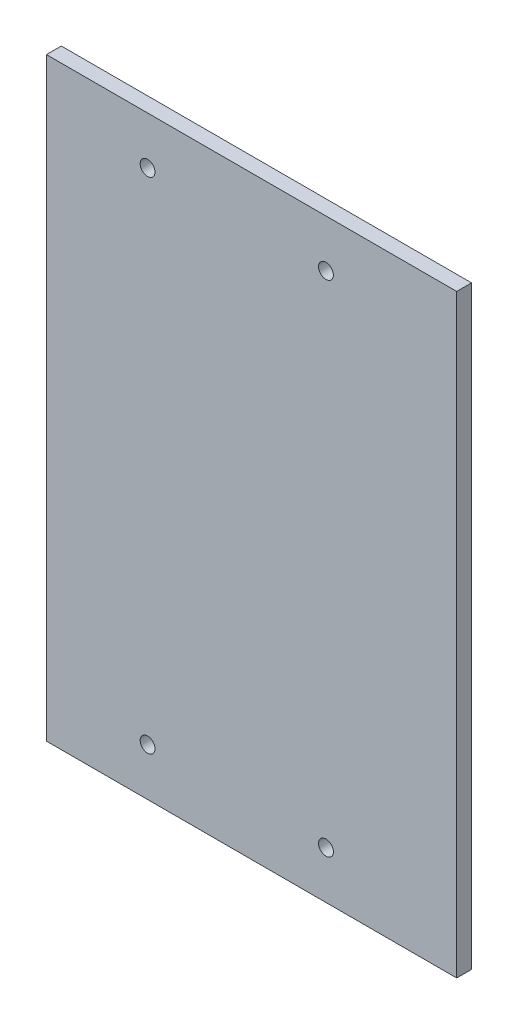
ISO-10303-21;
HEADER;
FILE_DESCRIPTION(('STEP AP214'),'2;1');
FILE_NAME('part.step','',(''),(''),'','','');
FILE_SCHEMA(('AUTOMOTIVE_DESIGN { 1 0 10303 214 1 1 1 1 }'));
ENDSEC;
DATA;
#1=APPLICATION_CONTEXT('core data for automotive mechanical design processes');
#2=APPLICATION_PROTOCOL_DEFINITION('international standard','automotive_design',2000,#1);
#3=PRODUCT_CONTEXT('',#1,'mechanical');
#4=PRODUCT('Part','Part','',(#3));
#5=PRODUCT_RELATED_PRODUCT_CATEGORY('part','',(#4));
#6=PRODUCT_DEFINITION_FORMATION('','',#4);
#7=PRODUCT_DEFINITION_CONTEXT('part definition',#1,'design');
#8=PRODUCT_DEFINITION('design','',#6,#7);
#9=PRODUCT_DEFINITION_SHAPE('','',#8);
#10=(LENGTH_UNIT() NAMED_UNIT(*) SI_UNIT(.MILLI.,.METRE.));
#11=(NAMED_UNIT(*) PLANE_ANGLE_UNIT() SI_UNIT($,.RADIAN.));
#12=(NAMED_UNIT(*) SI_UNIT($,.STERADIAN.) SOLID_ANGLE_UNIT());
#13=UNCERTAINTY_MEASURE_WITH_UNIT(LENGTH_MEASURE(1.E-05),#10,'distance_accuracy_value','');
#14=(GEOMETRIC_REPRESENTATION_CONTEXT(3) GLOBAL_UNCERTAINTY_ASSIGNED_CONTEXT((#13)) GLOBAL_UNIT_ASSIGNED_CONTEXT((#10,
#11,#12)) REPRESENTATION_CONTEXT('',''));
#15=CARTESIAN_POINT('',(0.,0.,0.));
#16=DIRECTION('',(0.,0.,1.));
#17=DIRECTION('',(1.,0.,0.));
#18=AXIS2_PLACEMENT_3D('',#15,#16,#17);
#19=CARTESIAN_POINT('',(-55.,100.,5.));
#20=DIRECTION('',(0.,-1.,0.));
#21=DIRECTION('',(0.,0.,-1.));
#22=AXIS2_PLACEMENT_3D('',#19,#20,#21);
#23=PLANE('',#22);
#24=DIRECTION('',(-1.,0.,0.));
#25=VECTOR('',#24,1.);
#26=CARTESIAN_POINT('',(-55.,100.,0.));
#27=LINE('',#26,#25);
#28=CARTESIAN_POINT('',(83.,100.,0.));
#29=VERTEX_POINT('',#28);
#30=CARTESIAN_POINT('',(-55.,100.,0.));
#31=VERTEX_POINT('',#30);
#32=EDGE_CURVE('E62',#29,#31,#27,.T.);
#33=ORIENTED_EDGE('',*,*,#32,.T.);
#34=DIRECTION('',(0.,0.,-1.));
#35=VECTOR('',#34,1.);
#36=CARTESIAN_POINT('',(-55.,100.,5.));
#37=LINE('',#36,#35);
#38=CARTESIAN_POINT('',(-55.,100.,5.));
#39=VERTEX_POINT('',#38);
#40=EDGE_CURVE('E11',#39,#31,#37,.T.);
#41=ORIENTED_EDGE('',*,*,#40,.F.);
#42=DIRECTION('',(-1.,0.,0.));
#43=VECTOR('',#42,1.);
#44=CARTESIAN_POINT('',(-55.,100.,5.));
#45=LINE('',#44,#43);
#46=CARTESIAN_POINT('',(83.,100.,5.));
#47=VERTEX_POINT('',#46);
#48=EDGE_CURVE('E87',#47,#39,#45,.T.);
#49=ORIENTED_EDGE('',*,*,#48,.F.);
#50=DIRECTION('',(0.,0.,1.));
#51=VECTOR('',#50,1.);
#52=CARTESIAN_POINT('',(83.,100.,0.));
#53=LINE('',#52,#51);
#54=EDGE_CURVE('E95',#29,#47,#53,.T.);
#55=ORIENTED_EDGE('',*,*,#54,.F.);
#56=EDGE_LOOP('',(#33,#41,#49,#55));
#57=FACE_BOUND('',#56,.T.);
#58=ADVANCED_FACE('F35',(#57),#23,.F.);
#59=CARTESIAN_POINT('',(-55.,100.,5.));
#60=DIRECTION('',(1.,0.,0.));
#61=DIRECTION('',(0.,1.,0.));
#62=AXIS2_PLACEMENT_3D('',#59,#60,#61);
#63=PLANE('',#62);
#64=DIRECTION('',(0.,-1.,0.));
#65=VECTOR('',#64,1.);
#66=CARTESIAN_POINT('',(-55.,100.,0.));
#67=LINE('',#66,#65);
#68=CARTESIAN_POINT('',(-55.,-100.,0.));
#69=VERTEX_POINT('',#68);
#70=EDGE_CURVE('E88',#31,#69,#67,.T.);
#71=ORIENTED_EDGE('',*,*,#70,.T.);
#72=DIRECTION('',(0.,0.,-1.));
#73=VECTOR('',#72,1.);
#74=CARTESIAN_POINT('',(-55.,-100.,5.));
#75=LINE('',#74,#73);
#76=CARTESIAN_POINT('',(-55.,-100.,5.));
#77=VERTEX_POINT('',#76);
#78=EDGE_CURVE('E43',#77,#69,#75,.T.);
#79=ORIENTED_EDGE('',*,*,#78,.F.);
#80=DIRECTION('',(0.,-1.,0.));
#81=VECTOR('',#80,1.);
#82=CARTESIAN_POINT('',(-55.,100.,5.));
#83=LINE('',#82,#81);
#84=EDGE_CURVE('E51',#39,#77,#83,.T.);
#85=ORIENTED_EDGE('',*,*,#84,.F.);
#86=ORIENTED_EDGE('',*,*,#40,.T.);
#87=EDGE_LOOP('',(#71,#79,#85,#86));
#88=FACE_BOUND('',#87,.T.);
#89=ADVANCED_FACE('F132',(#88),#63,.F.);
#90=CARTESIAN_POINT('',(-55.,-100.,5.));
#91=DIRECTION('',(0.,1.,0.));
#92=DIRECTION('',(0.,0.,1.));
#93=AXIS2_PLACEMENT_3D('',#90,#91,#92);
#94=PLANE('',#93);
#95=DIRECTION('',(1.,0.,0.));
#96=VECTOR('',#95,1.);
#97=CARTESIAN_POINT('',(-55.,-100.,0.));
#98=LINE('',#97,#96);
#99=CARTESIAN_POINT('',(83.,-100.,0.));
#100=VERTEX_POINT('',#99);
#101=EDGE_CURVE('E80',#69,#100,#98,.T.);
#102=ORIENTED_EDGE('',*,*,#101,.T.);
#103=DIRECTION('',(0.,0.,-1.));
#104=VECTOR('',#103,1.);
#105=CARTESIAN_POINT('',(83.,-100.,5.));
#106=LINE('',#105,#104);
#107=CARTESIAN_POINT('',(83.,-100.,5.));
#108=VERTEX_POINT('',#107);
#109=EDGE_CURVE('E84',#108,#100,#106,.T.);
#110=ORIENTED_EDGE('',*,*,#109,.F.);
#111=DIRECTION('',(1.,0.,0.));
#112=VECTOR('',#111,1.);
#113=CARTESIAN_POINT('',(-55.,-100.,5.));
#114=LINE('',#113,#112);
#115=EDGE_CURVE('E67',#77,#108,#114,.T.);
#116=ORIENTED_EDGE('',*,*,#115,.F.);
#117=ORIENTED_EDGE('',*,*,#78,.T.);
#118=EDGE_LOOP('',(#102,#110,#116,#117));
#119=FACE_BOUND('',#118,.T.);
#120=ADVANCED_FACE('F82',(#119),#94,.F.);
#121=CARTESIAN_POINT('',(0.,0.,5.));
#122=DIRECTION('',(0.,0.,1.));
#123=DIRECTION('',(1.,0.,0.));
#124=AXIS2_PLACEMENT_3D('',#121,#122,#123);
#125=PLANE('',#124);
#126=CARTESIAN_POINT('',(39.0192378864669,-83.9999999999995,5.));
#127=DIRECTION('',(0.,0.,-1.));
#128=DIRECTION('',(-1.,0.,0.));
#129=AXIS2_PLACEMENT_3D('',#126,#127,#128);
#130=CIRCLE('',#129,2.5);
#131=CARTESIAN_POINT('',(36.5192378864669,-83.9999999999995,5.));
#132=VERTEX_POINT('',#131);
#133=EDGE_CURVE('E110',#132,#132,#130,.T.);
#134=ORIENTED_EDGE('',*,*,#133,.T.);
#135=EDGE_LOOP('',(#134));
#136=FACE_BOUND('',#135,.T.);
#137=CARTESIAN_POINT('',(-20.980762113533,84.,5.));
#138=DIRECTION('',(0.,0.,-1.));
#139=DIRECTION('',(-1.,0.,0.));
#140=AXIS2_PLACEMENT_3D('',#137,#138,#139);
#141=CIRCLE('',#140,2.49999999999999);
#142=CARTESIAN_POINT('',(-23.480762113533,84.,5.));
#143=VERTEX_POINT('',#142);
#144=EDGE_CURVE('E117',#143,#143,#141,.T.);
#145=ORIENTED_EDGE('',*,*,#144,.T.);
#146=EDGE_LOOP('',(#145));
#147=FACE_BOUND('',#146,.T.);
#148=CARTESIAN_POINT('',(39.0192378864669,84.,5.));
#149=DIRECTION('',(0.,0.,-1.));
#150=DIRECTION('',(-1.,0.,0.));
#151=AXIS2_PLACEMENT_3D('',#148,#149,#150);
#152=CIRCLE('',#151,2.5);
#153=CARTESIAN_POINT('',(36.5192378864669,84.,5.));
#154=VERTEX_POINT('',#153);
#155=EDGE_CURVE('E104',#154,#154,#152,.T.);
#156=ORIENTED_EDGE('',*,*,#155,.T.);
#157=EDGE_LOOP('',(#156));
#158=FACE_BOUND('',#157,.T.);
#159=CARTESIAN_POINT('',(-20.980762113533,-83.9999999999995,5.));
#160=DIRECTION('',(0.,0.,-1.));
#161=DIRECTION('',(-1.,0.,0.));
#162=AXIS2_PLACEMENT_3D('',#159,#160,#161);
#163=CIRCLE('',#162,2.49999999999999);
#164=CARTESIAN_POINT('',(-23.480762113533,-83.9999999999995,5.));
#165=VERTEX_POINT('',#164);
#166=EDGE_CURVE('E122',#165,#165,#163,.T.);
#167=ORIENTED_EDGE('',*,*,#166,.T.);
#168=EDGE_LOOP('',(#167));
#169=FACE_BOUND('',#168,.T.);
#170=ORIENTED_EDGE('',*,*,#115,.T.);
#171=DIRECTION('',(0.,-1.,0.));
#172=VECTOR('',#171,1.);
#173=CARTESIAN_POINT('',(83.,100.,5.));
#174=LINE('',#173,#172);
#175=EDGE_CURVE('E98',#47,#108,#174,.T.);
#176=ORIENTED_EDGE('',*,*,#175,.F.);
#177=ORIENTED_EDGE('',*,*,#48,.T.);
#178=ORIENTED_EDGE('',*,*,#84,.T.);
#179=EDGE_LOOP('',(#170,#176,#177,#178));
#180=FACE_BOUND('',#179,.T.);
#181=ADVANCED_FACE('F133',(#136,#147,#158,#169,#180),#125,.T.);
#182=CARTESIAN_POINT('',(0.,0.,0.));
#183=DIRECTION('',(0.,0.,1.));
#184=DIRECTION('',(1.,0.,0.));
#185=AXIS2_PLACEMENT_3D('',#182,#183,#184);
#186=PLANE('',#185);
#187=CARTESIAN_POINT('',(39.0192378864669,-83.9999999999995,0.));
#188=DIRECTION('',(0.,0.,-1.));
#189=DIRECTION('',(-1.,0.,0.));
#190=AXIS2_PLACEMENT_3D('',#187,#188,#189);
#191=CIRCLE('',#190,2.5);
#192=CARTESIAN_POINT('',(36.5192378864669,-83.9999999999995,0.));
#193=VERTEX_POINT('',#192);
#194=EDGE_CURVE('E114',#193,#193,#191,.T.);
#195=ORIENTED_EDGE('',*,*,#194,.F.);
#196=EDGE_LOOP('',(#195));
#197=FACE_BOUND('',#196,.T.);
#198=CARTESIAN_POINT('',(-20.980762113533,84.,0.));
#199=DIRECTION('',(0.,0.,-1.));
#200=DIRECTION('',(-1.,0.,0.));
#201=AXIS2_PLACEMENT_3D('',#198,#199,#200);
#202=CIRCLE('',#201,2.49999999999999);
#203=CARTESIAN_POINT('',(-23.480762113533,84.,0.));
#204=VERTEX_POINT('',#203);
#205=EDGE_CURVE('E107',#204,#204,#202,.T.);
#206=ORIENTED_EDGE('',*,*,#205,.F.);
#207=EDGE_LOOP('',(#206));
#208=FACE_BOUND('',#207,.T.);
#209=CARTESIAN_POINT('',(39.0192378864669,84.,0.));
#210=DIRECTION('',(0.,0.,-1.));
#211=DIRECTION('',(-1.,0.,0.));
#212=AXIS2_PLACEMENT_3D('',#209,#210,#211);
#213=CIRCLE('',#212,2.5);
#214=CARTESIAN_POINT('',(36.5192378864669,84.,0.));
#215=VERTEX_POINT('',#214);
#216=EDGE_CURVE('E103',#215,#215,#213,.T.);
#217=ORIENTED_EDGE('',*,*,#216,.F.);
#218=EDGE_LOOP('',(#217));
#219=FACE_BOUND('',#218,.T.);
#220=CARTESIAN_POINT('',(-20.980762113533,-83.9999999999995,0.));
#221=DIRECTION('',(0.,0.,-1.));
#222=DIRECTION('',(-1.,0.,0.));
#223=AXIS2_PLACEMENT_3D('',#220,#221,#222);
#224=CIRCLE('',#223,2.49999999999999);
#225=CARTESIAN_POINT('',(-23.480762113533,-83.9999999999995,0.));
#226=VERTEX_POINT('',#225);
#227=EDGE_CURVE('E113',#226,#226,#224,.T.);
#228=ORIENTED_EDGE('',*,*,#227,.F.);
#229=EDGE_LOOP('',(#228));
#230=FACE_BOUND('',#229,.T.);
#231=ORIENTED_EDGE('',*,*,#32,.F.);
#232=DIRECTION('',(0.,1.,0.));
#233=VECTOR('',#232,1.);
#234=CARTESIAN_POINT('',(83.,-100.,0.));
#235=LINE('',#234,#233);
#236=EDGE_CURVE('E91',#100,#29,#235,.T.);
#237=ORIENTED_EDGE('',*,*,#236,.F.);
#238=ORIENTED_EDGE('',*,*,#101,.F.);
#239=ORIENTED_EDGE('',*,*,#70,.F.);
#240=EDGE_LOOP('',(#231,#237,#238,#239));
#241=FACE_BOUND('',#240,.T.);
#242=ADVANCED_FACE('F92',(#197,#208,#219,#230,#241),#186,.F.);
#243=CARTESIAN_POINT('',(-20.980762113533,-83.9999999999995,5.));
#244=DIRECTION('',(0.,0.,-1.));
#245=DIRECTION('',(-1.,0.,0.));
#246=AXIS2_PLACEMENT_3D('',#243,#244,#245);
#247=CYLINDRICAL_SURFACE('',#246,2.49999999999999);
#248=ORIENTED_EDGE('',*,*,#166,.F.);
#249=EDGE_LOOP('',(#248));
#250=FACE_BOUND('',#249,.T.);
#251=ORIENTED_EDGE('',*,*,#227,.T.);
#252=EDGE_LOOP('',(#251));
#253=FACE_BOUND('',#252,.T.);
#254=ADVANCED_FACE('F141',(#250,#253),#247,.F.);
#255=CARTESIAN_POINT('',(39.0192378864669,84.,5.));
#256=DIRECTION('',(0.,0.,-1.));
#257=DIRECTION('',(-1.,0.,0.));
#258=AXIS2_PLACEMENT_3D('',#255,#256,#257);
#259=CYLINDRICAL_SURFACE('',#258,2.5);
#260=ORIENTED_EDGE('',*,*,#155,.F.);
#261=EDGE_LOOP('',(#260));
#262=FACE_BOUND('',#261,.T.);
#263=ORIENTED_EDGE('',*,*,#216,.T.);
#264=EDGE_LOOP('',(#263));
#265=FACE_BOUND('',#264,.T.);
#266=ADVANCED_FACE('F160',(#262,#265),#259,.F.);
#267=CARTESIAN_POINT('',(-20.980762113533,84.,5.));
#268=DIRECTION('',(0.,0.,-1.));
#269=DIRECTION('',(-1.,0.,0.));
#270=AXIS2_PLACEMENT_3D('',#267,#268,#269);
#271=CYLINDRICAL_SURFACE('',#270,2.49999999999999);
#272=ORIENTED_EDGE('',*,*,#144,.F.);
#273=EDGE_LOOP('',(#272));
#274=FACE_BOUND('',#273,.T.);
#275=ORIENTED_EDGE('',*,*,#205,.T.);
#276=EDGE_LOOP('',(#275));
#277=FACE_BOUND('',#276,.T.);
#278=ADVANCED_FACE('F167',(#274,#277),#271,.F.);
#279=CARTESIAN_POINT('',(39.0192378864669,-83.9999999999995,5.));
#280=DIRECTION('',(0.,0.,-1.));
#281=DIRECTION('',(-1.,0.,0.));
#282=AXIS2_PLACEMENT_3D('',#279,#280,#281);
#283=CYLINDRICAL_SURFACE('',#282,2.5);
#284=ORIENTED_EDGE('',*,*,#133,.F.);
#285=EDGE_LOOP('',(#284));
#286=FACE_BOUND('',#285,.T.);
#287=ORIENTED_EDGE('',*,*,#194,.T.);
#288=EDGE_LOOP('',(#287));
#289=FACE_BOUND('',#288,.T.);
#290=ADVANCED_FACE('F174',(#286,#289),#283,.F.);
#291=CARTESIAN_POINT('',(83.,0.,0.));
#292=DIRECTION('',(1.,0.,0.));
#293=DIRECTION('',(0.,1.,0.));
#294=AXIS2_PLACEMENT_3D('',#291,#292,#293);
#295=PLANE('',#294);
#296=ORIENTED_EDGE('',*,*,#109,.T.);
#297=ORIENTED_EDGE('',*,*,#236,.T.);
#298=ORIENTED_EDGE('',*,*,#54,.T.);
#299=ORIENTED_EDGE('',*,*,#175,.T.);
#300=EDGE_LOOP('',(#296,#297,#298,#299));
#301=FACE_BOUND('',#300,.T.);
#302=ADVANCED_FACE('F97',(#301),#295,.T.);
#303=CLOSED_SHELL('',(#58,#89,#120,#181,#242,#254,#266,#278,#290,#302));
#304=MANIFOLD_SOLID_BREP('B2',#303);
#305=ADVANCED_BREP_SHAPE_REPRESENTATION('',(#18,#304),#14);
#306=SHAPE_DEFINITION_REPRESENTATION(#9,#305);
ENDSEC;
END-ISO-10303-21;
